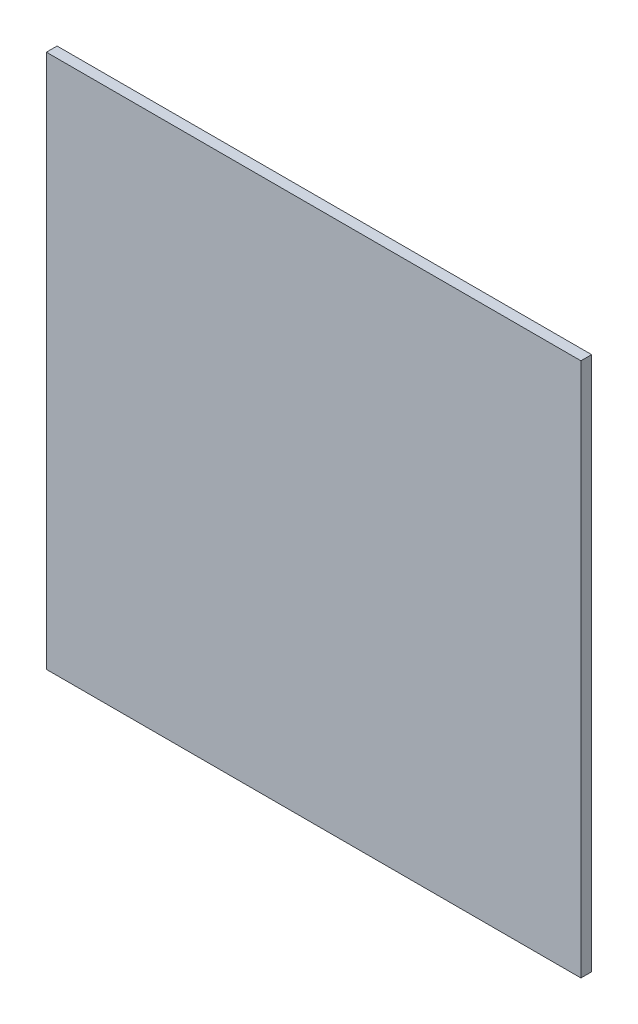
ISO-10303-21;
HEADER;
FILE_DESCRIPTION(('STEP AP214'),'2;1');
FILE_NAME('part.step','',(''),(''),'','','');
FILE_SCHEMA(('AUTOMOTIVE_DESIGN { 1 0 10303 214 1 1 1 1 }'));
ENDSEC;
DATA;
#1=APPLICATION_CONTEXT('core data for automotive mechanical design processes');
#2=APPLICATION_PROTOCOL_DEFINITION('international standard','automotive_design',2000,#1);
#3=PRODUCT_CONTEXT('',#1,'mechanical');
#4=PRODUCT('Part','Part','',(#3));
#5=PRODUCT_RELATED_PRODUCT_CATEGORY('part','',(#4));
#6=PRODUCT_DEFINITION_FORMATION('','',#4);
#7=PRODUCT_DEFINITION_CONTEXT('part definition',#1,'design');
#8=PRODUCT_DEFINITION('design','',#6,#7);
#9=PRODUCT_DEFINITION_SHAPE('','',#8);
#10=(LENGTH_UNIT() NAMED_UNIT(*) SI_UNIT(.MILLI.,.METRE.));
#11=(NAMED_UNIT(*) PLANE_ANGLE_UNIT() SI_UNIT($,.RADIAN.));
#12=(NAMED_UNIT(*) SI_UNIT($,.STERADIAN.) SOLID_ANGLE_UNIT());
#13=UNCERTAINTY_MEASURE_WITH_UNIT(LENGTH_MEASURE(1.E-05),#10,'distance_accuracy_value','');
#14=(GEOMETRIC_REPRESENTATION_CONTEXT(3) GLOBAL_UNCERTAINTY_ASSIGNED_CONTEXT((#13)) GLOBAL_UNIT_ASSIGNED_CONTEXT((#10,
#11,#12)) REPRESENTATION_CONTEXT('',''));
#15=CARTESIAN_POINT('',(0.,0.,0.));
#16=DIRECTION('',(0.,0.,1.));
#17=DIRECTION('',(1.,0.,0.));
#18=AXIS2_PLACEMENT_3D('',#15,#16,#17);
#19=CARTESIAN_POINT('',(0.,0.,5.));
#20=DIRECTION('',(1.,0.,0.));
#21=DIRECTION('',(0.,0.,-1.));
#22=AXIS2_PLACEMENT_3D('',#19,#20,#21);
#23=PLANE('',#22);
#24=DIRECTION('',(0.,-1.,0.));
#25=VECTOR('',#24,1.);
#26=CARTESIAN_POINT('',(0.,0.,0.));
#27=LINE('',#26,#25);
#28=CARTESIAN_POINT('',(0.,250.,0.));
#29=VERTEX_POINT('',#28);
#30=CARTESIAN_POINT('',(0.,0.,0.));
#31=VERTEX_POINT('',#30);
#32=EDGE_CURVE('E107',#29,#31,#27,.T.);
#33=ORIENTED_EDGE('',*,*,#32,.T.);
#34=DIRECTION('',(0.,0.,-1.));
#35=VECTOR('',#34,1.);
#36=CARTESIAN_POINT('',(0.,0.,5.));
#37=LINE('',#36,#35);
#38=CARTESIAN_POINT('',(0.,0.,5.));
#39=VERTEX_POINT('',#38);
#40=EDGE_CURVE('E11',#39,#31,#37,.T.);
#41=ORIENTED_EDGE('',*,*,#40,.F.);
#42=DIRECTION('',(0.,-1.,0.));
#43=VECTOR('',#42,1.);
#44=CARTESIAN_POINT('',(0.,0.,5.));
#45=LINE('',#44,#43);
#46=CARTESIAN_POINT('',(0.,250.,5.));
#47=VERTEX_POINT('',#46);
#48=EDGE_CURVE('E91',#47,#39,#45,.T.);
#49=ORIENTED_EDGE('',*,*,#48,.F.);
#50=DIRECTION('',(0.,0.,-1.));
#51=VECTOR('',#50,1.);
#52=CARTESIAN_POINT('',(0.,250.,5.));
#53=LINE('',#52,#51);
#54=EDGE_CURVE('E103',#47,#29,#53,.T.);
#55=ORIENTED_EDGE('',*,*,#54,.T.);
#56=EDGE_LOOP('',(#33,#41,#49,#55));
#57=FACE_BOUND('',#56,.T.);
#58=ADVANCED_FACE('F39',(#57),#23,.F.);
#59=CARTESIAN_POINT('',(0.,0.,5.));
#60=DIRECTION('',(0.,1.,0.));
#61=DIRECTION('',(0.,0.,1.));
#62=AXIS2_PLACEMENT_3D('',#59,#60,#61);
#63=PLANE('',#62);
#64=DIRECTION('',(1.,0.,0.));
#65=VECTOR('',#64,1.);
#66=CARTESIAN_POINT('',(0.,0.,0.));
#67=LINE('',#66,#65);
#68=CARTESIAN_POINT('',(250.,0.,0.));
#69=VERTEX_POINT('',#68);
#70=EDGE_CURVE('E96',#31,#69,#67,.T.);
#71=ORIENTED_EDGE('',*,*,#70,.T.);
#72=DIRECTION('',(0.,0.,-1.));
#73=VECTOR('',#72,1.);
#74=CARTESIAN_POINT('',(250.,0.,5.));
#75=LINE('',#74,#73);
#76=CARTESIAN_POINT('',(250.,0.,5.));
#77=VERTEX_POINT('',#76);
#78=EDGE_CURVE('E48',#77,#69,#75,.T.);
#79=ORIENTED_EDGE('',*,*,#78,.F.);
#80=DIRECTION('',(1.,0.,0.));
#81=VECTOR('',#80,1.);
#82=CARTESIAN_POINT('',(0.,0.,5.));
#83=LINE('',#82,#81);
#84=EDGE_CURVE('E86',#39,#77,#83,.T.);
#85=ORIENTED_EDGE('',*,*,#84,.F.);
#86=ORIENTED_EDGE('',*,*,#40,.T.);
#87=EDGE_LOOP('',(#71,#79,#85,#86));
#88=FACE_BOUND('',#87,.T.);
#89=ADVANCED_FACE('F95',(#88),#63,.F.);
#90=CARTESIAN_POINT('',(250.,0.,5.));
#91=DIRECTION('',(-1.,0.,0.));
#92=DIRECTION('',(0.,0.,1.));
#93=AXIS2_PLACEMENT_3D('',#90,#91,#92);
#94=PLANE('',#93);
#95=DIRECTION('',(0.,1.,0.));
#96=VECTOR('',#95,1.);
#97=CARTESIAN_POINT('',(250.,0.,0.));
#98=LINE('',#97,#96);
#99=CARTESIAN_POINT('',(250.,250.,0.));
#100=VERTEX_POINT('',#99);
#101=EDGE_CURVE('E73',#69,#100,#98,.T.);
#102=ORIENTED_EDGE('',*,*,#101,.T.);
#103=DIRECTION('',(0.,0.,-1.));
#104=VECTOR('',#103,1.);
#105=CARTESIAN_POINT('',(250.,250.,5.));
#106=LINE('',#105,#104);
#107=CARTESIAN_POINT('',(250.,250.,5.));
#108=VERTEX_POINT('',#107);
#109=EDGE_CURVE('E98',#108,#100,#106,.T.);
#110=ORIENTED_EDGE('',*,*,#109,.F.);
#111=DIRECTION('',(0.,1.,0.));
#112=VECTOR('',#111,1.);
#113=CARTESIAN_POINT('',(250.,0.,5.));
#114=LINE('',#113,#112);
#115=EDGE_CURVE('E89',#77,#108,#114,.T.);
#116=ORIENTED_EDGE('',*,*,#115,.F.);
#117=ORIENTED_EDGE('',*,*,#78,.T.);
#118=EDGE_LOOP('',(#102,#110,#116,#117));
#119=FACE_BOUND('',#118,.T.);
#120=ADVANCED_FACE('F99',(#119),#94,.F.);
#121=CARTESIAN_POINT('',(0.,250.,5.));
#122=DIRECTION('',(0.,-1.,0.));
#123=DIRECTION('',(0.,0.,-1.));
#124=AXIS2_PLACEMENT_3D('',#121,#122,#123);
#125=PLANE('',#124);
#126=DIRECTION('',(-1.,0.,0.));
#127=VECTOR('',#126,1.);
#128=CARTESIAN_POINT('',(0.,250.,0.));
#129=LINE('',#128,#127);
#130=EDGE_CURVE('E79',#100,#29,#129,.T.);
#131=ORIENTED_EDGE('',*,*,#130,.T.);
#132=ORIENTED_EDGE('',*,*,#54,.F.);
#133=DIRECTION('',(-1.,0.,0.));
#134=VECTOR('',#133,1.);
#135=CARTESIAN_POINT('',(0.,250.,5.));
#136=LINE('',#135,#134);
#137=EDGE_CURVE('E56',#108,#47,#136,.T.);
#138=ORIENTED_EDGE('',*,*,#137,.F.);
#139=ORIENTED_EDGE('',*,*,#109,.T.);
#140=EDGE_LOOP('',(#131,#132,#138,#139));
#141=FACE_BOUND('',#140,.T.);
#142=ADVANCED_FACE('F120',(#141),#125,.F.);
#143=CARTESIAN_POINT('',(0.,0.,5.));
#144=DIRECTION('',(0.,0.,-1.));
#145=DIRECTION('',(-1.,0.,0.));
#146=AXIS2_PLACEMENT_3D('',#143,#144,#145);
#147=PLANE('',#146);
#148=ORIENTED_EDGE('',*,*,#48,.T.);
#149=ORIENTED_EDGE('',*,*,#84,.T.);
#150=ORIENTED_EDGE('',*,*,#115,.T.);
#151=ORIENTED_EDGE('',*,*,#137,.T.);
#152=EDGE_LOOP('',(#148,#149,#150,#151));
#153=FACE_BOUND('',#152,.T.);
#154=ADVANCED_FACE('F87',(#153),#147,.F.);
#155=CARTESIAN_POINT('',(0.,0.,0.));
#156=DIRECTION('',(0.,0.,-1.));
#157=DIRECTION('',(-1.,0.,0.));
#158=AXIS2_PLACEMENT_3D('',#155,#156,#157);
#159=PLANE('',#158);
#160=ORIENTED_EDGE('',*,*,#32,.F.);
#161=ORIENTED_EDGE('',*,*,#130,.F.);
#162=ORIENTED_EDGE('',*,*,#101,.F.);
#163=ORIENTED_EDGE('',*,*,#70,.F.);
#164=EDGE_LOOP('',(#160,#161,#162,#163));
#165=FACE_BOUND('',#164,.T.);
#166=ADVANCED_FACE('F123',(#165),#159,.T.);
#167=CLOSED_SHELL('',(#58,#89,#120,#142,#154,#166));
#168=MANIFOLD_SOLID_BREP('B2',#167);
#169=ADVANCED_BREP_SHAPE_REPRESENTATION('',(#18,#168),#14);
#170=SHAPE_DEFINITION_REPRESENTATION(#9,#169);
ENDSEC;
END-ISO-10303-21;
